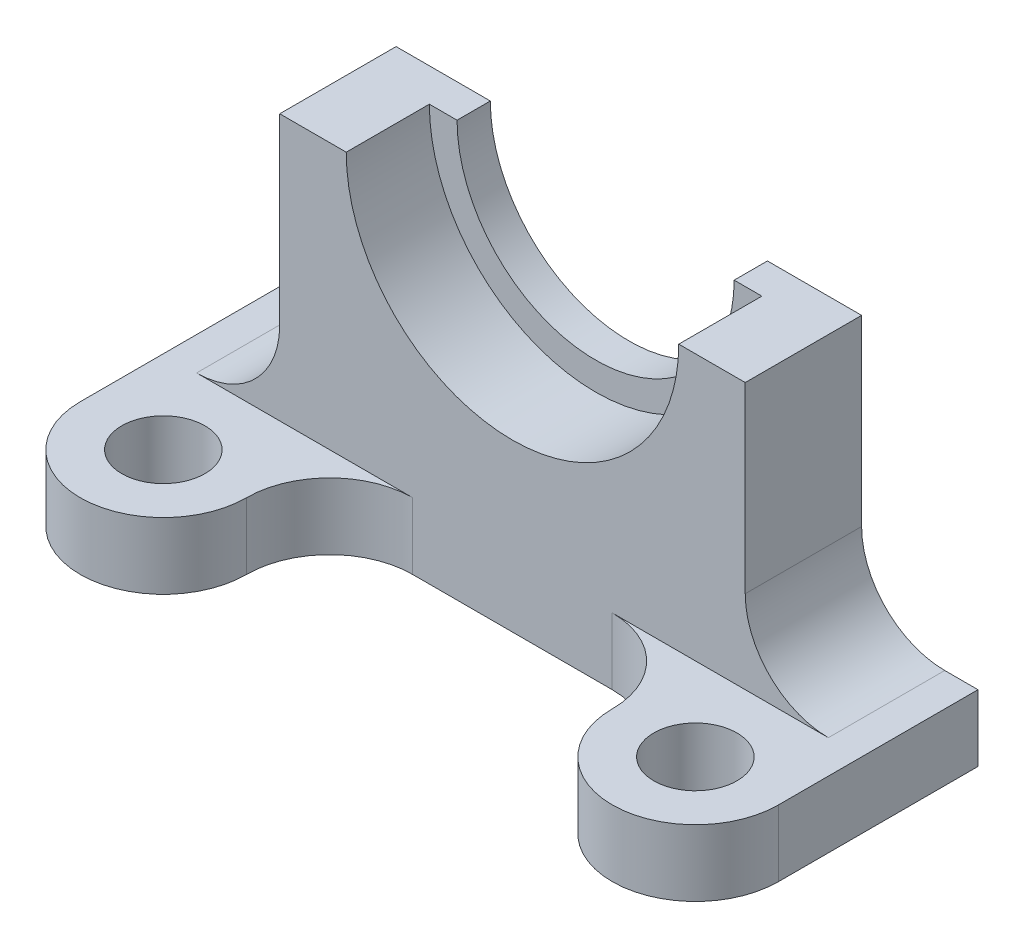
ISO-10303-21;
HEADER;
FILE_DESCRIPTION(('STEP AP214'),'2;1');
FILE_NAME('part.step','',(''),(''),'','','');
FILE_SCHEMA(('AUTOMOTIVE_DESIGN { 1 0 10303 214 1 1 1 1 }'));
ENDSEC;
DATA;
#1=APPLICATION_CONTEXT('core data for automotive mechanical design processes');
#2=APPLICATION_PROTOCOL_DEFINITION('international standard','automotive_design',2000,#1);
#3=PRODUCT_CONTEXT('',#1,'mechanical');
#4=PRODUCT('Part','Part','',(#3));
#5=PRODUCT_RELATED_PRODUCT_CATEGORY('part','',(#4));
#6=PRODUCT_DEFINITION_FORMATION('','',#4);
#7=PRODUCT_DEFINITION_CONTEXT('part definition',#1,'design');
#8=PRODUCT_DEFINITION('design','',#6,#7);
#9=PRODUCT_DEFINITION_SHAPE('','',#8);
#10=(LENGTH_UNIT() NAMED_UNIT(*) SI_UNIT(.MILLI.,.METRE.));
#11=(NAMED_UNIT(*) PLANE_ANGLE_UNIT() SI_UNIT($,.RADIAN.));
#12=(NAMED_UNIT(*) SI_UNIT($,.STERADIAN.) SOLID_ANGLE_UNIT());
#13=UNCERTAINTY_MEASURE_WITH_UNIT(LENGTH_MEASURE(1.E-05),#10,'distance_accuracy_value','');
#14=(GEOMETRIC_REPRESENTATION_CONTEXT(3) GLOBAL_UNCERTAINTY_ASSIGNED_CONTEXT((#13)) GLOBAL_UNIT_ASSIGNED_CONTEXT((#10,
#11,#12)) REPRESENTATION_CONTEXT('',''));
#15=CARTESIAN_POINT('',(0.,0.,0.));
#16=DIRECTION('',(0.,0.,1.));
#17=DIRECTION('',(1.,0.,0.));
#18=AXIS2_PLACEMENT_3D('',#15,#16,#17);
#19=CARTESIAN_POINT('',(210.,120.,-30.));
#20=DIRECTION('',(0.,1.,0.));
#21=DIRECTION('',(0.,0.,1.));
#22=AXIS2_PLACEMENT_3D('',#19,#20,#21);
#23=PLANE('',#22);
#24=DIRECTION('',(0.,0.,1.));
#25=VECTOR('',#24,1.);
#26=CARTESIAN_POINT('',(76.,120.,-90.));
#27=LINE('',#26,#25);
#28=CARTESIAN_POINT('',(76.,120.,-72.));
#29=VERTEX_POINT('',#28);
#30=CARTESIAN_POINT('',(76.,120.,-60.));
#31=VERTEX_POINT('',#30);
#32=EDGE_CURVE('E161',#29,#31,#27,.T.);
#33=ORIENTED_EDGE('',*,*,#32,.F.);
#34=DIRECTION('',(1.,0.,0.));
#35=VECTOR('',#34,1.);
#36=CARTESIAN_POINT('',(210.,120.,-72.));
#37=LINE('',#36,#35);
#38=CARTESIAN_POINT('',(42.,120.,-72.));
#39=VERTEX_POINT('',#38);
#40=EDGE_CURVE('E228',#39,#29,#37,.T.);
#41=ORIENTED_EDGE('',*,*,#40,.F.);
#42=DIRECTION('',(0.,0.,-1.));
#43=VECTOR('',#42,1.);
#44=CARTESIAN_POINT('',(42.,120.,-30.));
#45=LINE('',#44,#43);
#46=CARTESIAN_POINT('',(42.,120.,-30.));
#47=VERTEX_POINT('',#46);
#48=EDGE_CURVE('E242',#47,#39,#45,.T.);
#49=ORIENTED_EDGE('',*,*,#48,.F.);
#50=DIRECTION('',(1.,0.,0.));
#51=VECTOR('',#50,1.);
#52=CARTESIAN_POINT('',(210.,120.,-30.));
#53=LINE('',#52,#51);
#54=CARTESIAN_POINT('',(66.,120.,-30.));
#55=VERTEX_POINT('',#54);
#56=EDGE_CURVE('E366',#47,#55,#53,.T.);
#57=ORIENTED_EDGE('',*,*,#56,.T.);
#58=DIRECTION('',(0.,0.,1.));
#59=VECTOR('',#58,1.);
#60=CARTESIAN_POINT('',(66.,120.,-60.));
#61=LINE('',#60,#59);
#62=CARTESIAN_POINT('',(66.,120.,-60.));
#63=VERTEX_POINT('',#62);
#64=EDGE_CURVE('E166',#63,#55,#61,.T.);
#65=ORIENTED_EDGE('',*,*,#64,.F.);
#66=DIRECTION('',(1.,0.,0.));
#67=VECTOR('',#66,1.);
#68=CARTESIAN_POINT('',(210.,120.,-60.));
#69=LINE('',#68,#67);
#70=EDGE_CURVE('E182',#63,#31,#69,.T.);
#71=ORIENTED_EDGE('',*,*,#70,.T.);
#72=EDGE_LOOP('',(#33,#41,#49,#57,#65,#71));
#73=FACE_BOUND('',#72,.T.);
#74=ADVANCED_FACE('F33',(#73),#23,.T.);
#75=CARTESIAN_POINT('',(0.,24.,0.));
#76=DIRECTION('',(0.,1.,0.));
#77=DIRECTION('',(0.,0.,1.));
#78=AXIS2_PLACEMENT_3D('',#75,#76,#77);
#79=PLANE('',#78);
#80=CARTESIAN_POINT('',(29.9999999999999,24.,0.));
#81=DIRECTION('',(0.,1.,0.));
#82=DIRECTION('',(0.,0.,1.));
#83=AXIS2_PLACEMENT_3D('',#80,#81,#82);
#84=CIRCLE('',#83,15.);
#85=CARTESIAN_POINT('',(29.9999999999999,24.,15.));
#86=VERTEX_POINT('',#85);
#87=EDGE_CURVE('E266',#86,#86,#84,.T.);
#88=ORIENTED_EDGE('',*,*,#87,.F.);
#89=EDGE_LOOP('',(#88));
#90=FACE_BOUND('',#89,.T.);
#91=DIRECTION('',(-1.,0.,0.));
#92=VECTOR('',#91,1.);
#93=CARTESIAN_POINT('',(42.,24.,-30.));
#94=LINE('',#93,#92);
#95=CARTESIAN_POINT('',(90.,24.,-30.));
#96=VERTEX_POINT('',#95);
#97=CARTESIAN_POINT('',(12.,24.,-30.));
#98=VERTEX_POINT('',#97);
#99=EDGE_CURVE('E183',#96,#98,#94,.T.);
#100=ORIENTED_EDGE('',*,*,#99,.T.);
#101=DIRECTION('',(0.,0.,-1.));
#102=VECTOR('',#101,1.);
#103=CARTESIAN_POINT('',(12.,24.,-72.));
#104=LINE('',#103,#102);
#105=CARTESIAN_POINT('',(12.,24.,-72.));
#106=VERTEX_POINT('',#105);
#107=EDGE_CURVE('E165',#98,#106,#104,.T.);
#108=ORIENTED_EDGE('',*,*,#107,.T.);
#109=DIRECTION('',(1.,0.,0.));
#110=VECTOR('',#109,1.);
#111=CARTESIAN_POINT('',(0.,24.,-72.));
#112=LINE('',#111,#110);
#113=CARTESIAN_POINT('',(0.,24.,-72.));
#114=VERTEX_POINT('',#113);
#115=EDGE_CURVE('E253',#114,#106,#112,.T.);
#116=ORIENTED_EDGE('',*,*,#115,.F.);
#117=DIRECTION('',(0.,0.,-1.));
#118=VECTOR('',#117,1.);
#119=CARTESIAN_POINT('',(0.,24.,0.));
#120=LINE('',#119,#118);
#121=CARTESIAN_POINT('',(0.,24.,0.));
#122=VERTEX_POINT('',#121);
#123=EDGE_CURVE('E247',#122,#114,#120,.T.);
#124=ORIENTED_EDGE('',*,*,#123,.F.);
#125=CARTESIAN_POINT('',(29.9999999999999,24.,0.));
#126=DIRECTION('',(0.,1.,0.));
#127=DIRECTION('',(0.,0.,1.));
#128=AXIS2_PLACEMENT_3D('',#125,#126,#127);
#129=CIRCLE('',#128,30.);
#130=CARTESIAN_POINT('',(60.,24.,0.));
#131=VERTEX_POINT('',#130);
#132=EDGE_CURVE('E210',#122,#131,#129,.T.);
#133=ORIENTED_EDGE('',*,*,#132,.T.);
#134=CARTESIAN_POINT('',(90.,24.,0.));
#135=DIRECTION('',(0.,1.,0.));
#136=DIRECTION('',(0.,0.,1.));
#137=AXIS2_PLACEMENT_3D('',#134,#135,#136);
#138=CIRCLE('',#137,30.);
#139=EDGE_CURVE('E206',#131,#96,#138,.F.);
#140=ORIENTED_EDGE('',*,*,#139,.T.);
#141=EDGE_LOOP('',(#100,#108,#116,#124,#133,#140));
#142=FACE_BOUND('',#141,.T.);
#143=ADVANCED_FACE('F314',(#90,#142),#79,.T.);
#144=CARTESIAN_POINT('',(0.,24.,-72.));
#145=DIRECTION('',(0.,0.,-1.));
#146=DIRECTION('',(-1.,0.,0.));
#147=AXIS2_PLACEMENT_3D('',#144,#145,#146);
#148=PLANE('',#147);
#149=CARTESIAN_POINT('',(126.,120.,-72.));
#150=DIRECTION('',(0.,0.,-1.));
#151=DIRECTION('',(-1.,0.,0.));
#152=AXIS2_PLACEMENT_3D('',#149,#150,#151);
#153=CIRCLE('',#152,50.);
#154=CARTESIAN_POINT('',(176.,120.,-72.));
#155=VERTEX_POINT('',#154);
#156=EDGE_CURVE('E176',#155,#29,#153,.T.);
#157=ORIENTED_EDGE('',*,*,#156,.F.);
#158=CARTESIAN_POINT('',(210.,120.,-72.));
#159=VERTEX_POINT('',#158);
#160=EDGE_CURVE('E175',#155,#159,#37,.T.);
#161=ORIENTED_EDGE('',*,*,#160,.T.);
#162=DIRECTION('',(0.,-1.,0.));
#163=VECTOR('',#162,1.);
#164=CARTESIAN_POINT('',(210.,24.,-72.));
#165=LINE('',#164,#163);
#166=CARTESIAN_POINT('',(210.,54.,-72.));
#167=VERTEX_POINT('',#166);
#168=EDGE_CURVE('E227',#159,#167,#165,.T.);
#169=ORIENTED_EDGE('',*,*,#168,.T.);
#170=CARTESIAN_POINT('',(240.,54.,-72.));
#171=DIRECTION('',(0.,0.,-1.));
#172=DIRECTION('',(-1.,0.,0.));
#173=AXIS2_PLACEMENT_3D('',#170,#171,#172);
#174=CIRCLE('',#173,30.);
#175=CARTESIAN_POINT('',(240.,24.,-72.));
#176=VERTEX_POINT('',#175);
#177=EDGE_CURVE('E41',#167,#176,#174,.F.);
#178=ORIENTED_EDGE('',*,*,#177,.T.);
#179=CARTESIAN_POINT('',(252.,24.,-72.));
#180=VERTEX_POINT('',#179);
#181=EDGE_CURVE('E251',#176,#180,#112,.T.);
#182=ORIENTED_EDGE('',*,*,#181,.T.);
#183=DIRECTION('',(0.,-1.,0.));
#184=VECTOR('',#183,1.);
#185=CARTESIAN_POINT('',(252.,24.,-72.));
#186=LINE('',#185,#184);
#187=CARTESIAN_POINT('',(252.,0.,-72.));
#188=VERTEX_POINT('',#187);
#189=EDGE_CURVE('E264',#180,#188,#186,.T.);
#190=ORIENTED_EDGE('',*,*,#189,.T.);
#191=DIRECTION('',(1.,0.,0.));
#192=VECTOR('',#191,1.);
#193=CARTESIAN_POINT('',(0.,0.,-72.));
#194=LINE('',#193,#192);
#195=CARTESIAN_POINT('',(0.,0.,-72.));
#196=VERTEX_POINT('',#195);
#197=EDGE_CURVE('E241',#196,#188,#194,.T.);
#198=ORIENTED_EDGE('',*,*,#197,.F.);
#199=DIRECTION('',(0.,-1.,0.));
#200=VECTOR('',#199,1.);
#201=CARTESIAN_POINT('',(0.,24.,-72.));
#202=LINE('',#201,#200);
#203=EDGE_CURVE('E186',#114,#196,#202,.T.);
#204=ORIENTED_EDGE('',*,*,#203,.F.);
#205=ORIENTED_EDGE('',*,*,#115,.T.);
#206=CARTESIAN_POINT('',(12.,54.,-72.));
#207=DIRECTION('',(0.,0.,-1.));
#208=DIRECTION('',(-1.,0.,0.));
#209=AXIS2_PLACEMENT_3D('',#206,#207,#208);
#210=CIRCLE('',#209,30.);
#211=CARTESIAN_POINT('',(42.,54.,-72.));
#212=VERTEX_POINT('',#211);
#213=EDGE_CURVE('E317',#106,#212,#210,.F.);
#214=ORIENTED_EDGE('',*,*,#213,.T.);
#215=DIRECTION('',(0.,1.,0.));
#216=VECTOR('',#215,1.);
#217=CARTESIAN_POINT('',(42.,120.,-72.));
#218=LINE('',#217,#216);
#219=EDGE_CURVE('E197',#212,#39,#218,.T.);
#220=ORIENTED_EDGE('',*,*,#219,.T.);
#221=ORIENTED_EDGE('',*,*,#40,.T.);
#222=EDGE_LOOP('',(#157,#161,#169,#178,#182,#190,#198,#204,#205,#214,#220,#221));
#223=FACE_BOUND('',#222,.T.);
#224=ADVANCED_FACE('F316',(#223),#148,.T.);
#225=CARTESIAN_POINT('',(0.,24.,0.));
#226=DIRECTION('',(-1.,0.,0.));
#227=DIRECTION('',(0.,0.,1.));
#228=AXIS2_PLACEMENT_3D('',#225,#226,#227);
#229=PLANE('',#228);
#230=DIRECTION('',(0.,0.,-1.));
#231=VECTOR('',#230,1.);
#232=CARTESIAN_POINT('',(0.,0.,0.));
#233=LINE('',#232,#231);
#234=CARTESIAN_POINT('',(0.,0.,0.));
#235=VERTEX_POINT('',#234);
#236=EDGE_CURVE('E290',#235,#196,#233,.T.);
#237=ORIENTED_EDGE('',*,*,#236,.F.);
#238=DIRECTION('',(0.,-1.,0.));
#239=VECTOR('',#238,1.);
#240=CARTESIAN_POINT('',(0.,24.,0.));
#241=LINE('',#240,#239);
#242=EDGE_CURVE('E257',#122,#235,#241,.T.);
#243=ORIENTED_EDGE('',*,*,#242,.F.);
#244=ORIENTED_EDGE('',*,*,#123,.T.);
#245=ORIENTED_EDGE('',*,*,#203,.T.);
#246=EDGE_LOOP('',(#237,#243,#244,#245));
#247=FACE_BOUND('',#246,.T.);
#248=ADVANCED_FACE('F311',(#247),#229,.T.);
#249=CARTESIAN_POINT('',(29.9999999999999,24.,0.));
#250=DIRECTION('',(0.,-1.,0.));
#251=DIRECTION('',(0.,0.,-1.));
#252=AXIS2_PLACEMENT_3D('',#249,#250,#251);
#253=CYLINDRICAL_SURFACE('',#252,30.);
#254=CARTESIAN_POINT('',(29.9999999999999,0.,0.));
#255=DIRECTION('',(0.,1.,0.));
#256=DIRECTION('',(0.,0.,1.));
#257=AXIS2_PLACEMENT_3D('',#254,#255,#256);
#258=CIRCLE('',#257,30.);
#259=CARTESIAN_POINT('',(60.,0.,0.));
#260=VERTEX_POINT('',#259);
#261=EDGE_CURVE('E288',#235,#260,#258,.T.);
#262=ORIENTED_EDGE('',*,*,#261,.T.);
#263=DIRECTION('',(0.,-1.,0.));
#264=VECTOR('',#263,1.);
#265=CARTESIAN_POINT('',(60.,24.,0.));
#266=LINE('',#265,#264);
#267=EDGE_CURVE('E215',#131,#260,#266,.T.);
#268=ORIENTED_EDGE('',*,*,#267,.F.);
#269=ORIENTED_EDGE('',*,*,#132,.F.);
#270=ORIENTED_EDGE('',*,*,#242,.T.);
#271=EDGE_LOOP('',(#262,#268,#269,#270));
#272=FACE_BOUND('',#271,.T.);
#273=ADVANCED_FACE('F327',(#272),#253,.T.);
#274=CARTESIAN_POINT('',(90.,24.,0.));
#275=DIRECTION('',(0.,-1.,0.));
#276=DIRECTION('',(0.,0.,-1.));
#277=AXIS2_PLACEMENT_3D('',#274,#275,#276);
#278=CYLINDRICAL_SURFACE('',#277,30.);
#279=CARTESIAN_POINT('',(90.,0.,0.));
#280=DIRECTION('',(0.,1.,0.));
#281=DIRECTION('',(0.,0.,1.));
#282=AXIS2_PLACEMENT_3D('',#279,#280,#281);
#283=CIRCLE('',#282,30.);
#284=CARTESIAN_POINT('',(90.,0.,-30.));
#285=VERTEX_POINT('',#284);
#286=EDGE_CURVE('E285',#260,#285,#283,.F.);
#287=ORIENTED_EDGE('',*,*,#286,.T.);
#288=DIRECTION('',(0.,-1.,0.));
#289=VECTOR('',#288,1.);
#290=CARTESIAN_POINT('',(90.,24.,-30.));
#291=LINE('',#290,#289);
#292=EDGE_CURVE('E213',#96,#285,#291,.T.);
#293=ORIENTED_EDGE('',*,*,#292,.F.);
#294=ORIENTED_EDGE('',*,*,#139,.F.);
#295=ORIENTED_EDGE('',*,*,#267,.T.);
#296=EDGE_LOOP('',(#287,#293,#294,#295));
#297=FACE_BOUND('',#296,.T.);
#298=ADVANCED_FACE('F330',(#297),#278,.F.);
#299=CARTESIAN_POINT('',(0.,24.,-30.));
#300=DIRECTION('',(0.,0.,1.));
#301=DIRECTION('',(1.,0.,0.));
#302=AXIS2_PLACEMENT_3D('',#299,#300,#301);
#303=PLANE('',#302);
#304=CARTESIAN_POINT('',(126.,120.,-30.));
#305=DIRECTION('',(0.,0.,1.));
#306=DIRECTION('',(1.,0.,0.));
#307=AXIS2_PLACEMENT_3D('',#304,#305,#306);
#308=CIRCLE('',#307,60.);
#309=CARTESIAN_POINT('',(186.,120.,-30.));
#310=VERTEX_POINT('',#309);
#311=EDGE_CURVE('E359',#55,#310,#308,.T.);
#312=ORIENTED_EDGE('',*,*,#311,.F.);
#313=ORIENTED_EDGE('',*,*,#56,.F.);
#314=DIRECTION('',(0.,1.,0.));
#315=VECTOR('',#314,1.);
#316=CARTESIAN_POINT('',(42.,120.,-30.));
#317=LINE('',#316,#315);
#318=CARTESIAN_POINT('',(42.,54.,-30.));
#319=VERTEX_POINT('',#318);
#320=EDGE_CURVE('E230',#319,#47,#317,.T.);
#321=ORIENTED_EDGE('',*,*,#320,.F.);
#322=CARTESIAN_POINT('',(12.,54.,-30.));
#323=DIRECTION('',(0.,0.,1.));
#324=DIRECTION('',(1.,0.,0.));
#325=AXIS2_PLACEMENT_3D('',#322,#323,#324);
#326=CIRCLE('',#325,30.);
#327=EDGE_CURVE('E335',#319,#98,#326,.F.);
#328=ORIENTED_EDGE('',*,*,#327,.T.);
#329=ORIENTED_EDGE('',*,*,#99,.F.);
#330=ORIENTED_EDGE('',*,*,#292,.T.);
#331=DIRECTION('',(-1.,0.,0.));
#332=VECTOR('',#331,1.);
#333=CARTESIAN_POINT('',(0.,0.,-30.));
#334=LINE('',#333,#332);
#335=CARTESIAN_POINT('',(162.,0.,-30.));
#336=VERTEX_POINT('',#335);
#337=EDGE_CURVE('E282',#336,#285,#334,.T.);
#338=ORIENTED_EDGE('',*,*,#337,.F.);
#339=DIRECTION('',(0.,-1.,0.));
#340=VECTOR('',#339,1.);
#341=CARTESIAN_POINT('',(162.,24.,-30.));
#342=LINE('',#341,#340);
#343=CARTESIAN_POINT('',(162.,24.,-30.));
#344=VERTEX_POINT('',#343);
#345=EDGE_CURVE('E216',#344,#336,#342,.T.);
#346=ORIENTED_EDGE('',*,*,#345,.F.);
#347=CARTESIAN_POINT('',(240.,24.,-30.));
#348=VERTEX_POINT('',#347);
#349=EDGE_CURVE('E47',#348,#344,#94,.T.);
#350=ORIENTED_EDGE('',*,*,#349,.F.);
#351=CARTESIAN_POINT('',(240.,54.,-30.));
#352=DIRECTION('',(0.,0.,1.));
#353=DIRECTION('',(1.,0.,0.));
#354=AXIS2_PLACEMENT_3D('',#351,#352,#353);
#355=CIRCLE('',#354,30.);
#356=CARTESIAN_POINT('',(210.,54.,-30.));
#357=VERTEX_POINT('',#356);
#358=EDGE_CURVE('E11',#348,#357,#355,.F.);
#359=ORIENTED_EDGE('',*,*,#358,.T.);
#360=DIRECTION('',(0.,-1.,0.));
#361=VECTOR('',#360,1.);
#362=CARTESIAN_POINT('',(210.,24.,-30.));
#363=LINE('',#362,#361);
#364=CARTESIAN_POINT('',(210.,120.,-30.));
#365=VERTEX_POINT('',#364);
#366=EDGE_CURVE('E237',#365,#357,#363,.T.);
#367=ORIENTED_EDGE('',*,*,#366,.F.);
#368=EDGE_CURVE('E365',#310,#365,#53,.T.);
#369=ORIENTED_EDGE('',*,*,#368,.F.);
#370=EDGE_LOOP('',(#312,#313,#321,#328,#329,#330,#338,#346,#350,#359,#367,#369));
#371=FACE_BOUND('',#370,.T.);
#372=ADVANCED_FACE('F337',(#371),#303,.T.);
#373=CARTESIAN_POINT('',(162.,24.,0.));
#374=DIRECTION('',(0.,-1.,0.));
#375=DIRECTION('',(0.,0.,-1.));
#376=AXIS2_PLACEMENT_3D('',#373,#374,#375);
#377=CYLINDRICAL_SURFACE('',#376,30.);
#378=CARTESIAN_POINT('',(162.,0.,0.));
#379=DIRECTION('',(0.,1.,0.));
#380=DIRECTION('',(0.,0.,1.));
#381=AXIS2_PLACEMENT_3D('',#378,#379,#380);
#382=CIRCLE('',#381,30.);
#383=CARTESIAN_POINT('',(192.,0.,0.));
#384=VERTEX_POINT('',#383);
#385=EDGE_CURVE('E279',#384,#336,#382,.T.);
#386=ORIENTED_EDGE('',*,*,#385,.F.);
#387=DIRECTION('',(0.,-1.,0.));
#388=VECTOR('',#387,1.);
#389=CARTESIAN_POINT('',(192.,24.,0.));
#390=LINE('',#389,#388);
#391=CARTESIAN_POINT('',(192.,24.,0.));
#392=VERTEX_POINT('',#391);
#393=EDGE_CURVE('E220',#392,#384,#390,.T.);
#394=ORIENTED_EDGE('',*,*,#393,.F.);
#395=CARTESIAN_POINT('',(162.,24.,0.));
#396=DIRECTION('',(0.,1.,0.));
#397=DIRECTION('',(0.,0.,1.));
#398=AXIS2_PLACEMENT_3D('',#395,#396,#397);
#399=CIRCLE('',#398,30.);
#400=EDGE_CURVE('E209',#392,#344,#399,.T.);
#401=ORIENTED_EDGE('',*,*,#400,.T.);
#402=ORIENTED_EDGE('',*,*,#345,.T.);
#403=EDGE_LOOP('',(#386,#394,#401,#402));
#404=FACE_BOUND('',#403,.T.);
#405=ADVANCED_FACE('F436',(#404),#377,.F.);
#406=CARTESIAN_POINT('',(222.,24.,0.));
#407=DIRECTION('',(0.,-1.,0.));
#408=DIRECTION('',(0.,0.,-1.));
#409=AXIS2_PLACEMENT_3D('',#406,#407,#408);
#410=CYLINDRICAL_SURFACE('',#409,30.);
#411=CARTESIAN_POINT('',(222.,0.,0.));
#412=DIRECTION('',(0.,1.,0.));
#413=DIRECTION('',(0.,0.,1.));
#414=AXIS2_PLACEMENT_3D('',#411,#412,#413);
#415=CIRCLE('',#414,30.);
#416=CARTESIAN_POINT('',(252.,0.,0.));
#417=VERTEX_POINT('',#416);
#418=EDGE_CURVE('E276',#417,#384,#415,.F.);
#419=ORIENTED_EDGE('',*,*,#418,.F.);
#420=DIRECTION('',(0.,-1.,0.));
#421=VECTOR('',#420,1.);
#422=CARTESIAN_POINT('',(252.,24.,0.));
#423=LINE('',#422,#421);
#424=CARTESIAN_POINT('',(252.,24.,0.));
#425=VERTEX_POINT('',#424);
#426=EDGE_CURVE('E262',#425,#417,#423,.T.);
#427=ORIENTED_EDGE('',*,*,#426,.F.);
#428=CARTESIAN_POINT('',(222.,24.,0.));
#429=DIRECTION('',(0.,1.,0.));
#430=DIRECTION('',(0.,0.,1.));
#431=AXIS2_PLACEMENT_3D('',#428,#429,#430);
#432=CIRCLE('',#431,30.);
#433=EDGE_CURVE('E225',#425,#392,#432,.F.);
#434=ORIENTED_EDGE('',*,*,#433,.T.);
#435=ORIENTED_EDGE('',*,*,#393,.T.);
#436=EDGE_LOOP('',(#419,#427,#434,#435));
#437=FACE_BOUND('',#436,.T.);
#438=ADVANCED_FACE('F536',(#437),#410,.T.);
#439=CARTESIAN_POINT('',(222.,24.,0.));
#440=DIRECTION('',(0.,-1.,0.));
#441=DIRECTION('',(0.,0.,-1.));
#442=AXIS2_PLACEMENT_3D('',#439,#440,#441);
#443=CYLINDRICAL_SURFACE('',#442,15.);
#444=CARTESIAN_POINT('',(222.,24.,0.));
#445=DIRECTION('',(0.,1.,0.));
#446=DIRECTION('',(0.,0.,1.));
#447=AXIS2_PLACEMENT_3D('',#444,#445,#446);
#448=CIRCLE('',#447,15.);
#449=CARTESIAN_POINT('',(222.,24.,15.));
#450=VERTEX_POINT('',#449);
#451=EDGE_CURVE('E297',#450,#450,#448,.T.);
#452=ORIENTED_EDGE('',*,*,#451,.T.);
#453=EDGE_LOOP('',(#452));
#454=FACE_BOUND('',#453,.T.);
#455=CARTESIAN_POINT('',(222.,0.,0.));
#456=DIRECTION('',(0.,1.,0.));
#457=DIRECTION('',(0.,0.,1.));
#458=AXIS2_PLACEMENT_3D('',#455,#456,#457);
#459=CIRCLE('',#458,15.);
#460=CARTESIAN_POINT('',(222.,0.,15.));
#461=VERTEX_POINT('',#460);
#462=EDGE_CURVE('E270',#461,#461,#459,.T.);
#463=ORIENTED_EDGE('',*,*,#462,.F.);
#464=EDGE_LOOP('',(#463));
#465=FACE_BOUND('',#464,.T.);
#466=ADVANCED_FACE('F540',(#454,#465),#443,.F.);
#467=CARTESIAN_POINT('',(252.,24.,1.94289029309402E-13));
#468=DIRECTION('',(1.,0.,0.));
#469=DIRECTION('',(0.,0.,-1.));
#470=AXIS2_PLACEMENT_3D('',#467,#468,#469);
#471=PLANE('',#470);
#472=DIRECTION('',(0.,0.,1.));
#473=VECTOR('',#472,1.);
#474=CARTESIAN_POINT('',(252.,0.,1.94289029309402E-13));
#475=LINE('',#474,#473);
#476=EDGE_CURVE('E273',#188,#417,#475,.T.);
#477=ORIENTED_EDGE('',*,*,#476,.F.);
#478=ORIENTED_EDGE('',*,*,#189,.F.);
#479=DIRECTION('',(0.,0.,1.));
#480=VECTOR('',#479,1.);
#481=CARTESIAN_POINT('',(252.,24.,1.94289029309402E-13));
#482=LINE('',#481,#480);
#483=EDGE_CURVE('E300',#180,#425,#482,.T.);
#484=ORIENTED_EDGE('',*,*,#483,.T.);
#485=ORIENTED_EDGE('',*,*,#426,.T.);
#486=EDGE_LOOP('',(#477,#478,#484,#485));
#487=FACE_BOUND('',#486,.T.);
#488=ADVANCED_FACE('F542',(#487),#471,.T.);
#489=CARTESIAN_POINT('',(29.9999999999999,24.,0.));
#490=DIRECTION('',(0.,-1.,0.));
#491=DIRECTION('',(0.,0.,-1.));
#492=AXIS2_PLACEMENT_3D('',#489,#490,#491);
#493=CYLINDRICAL_SURFACE('',#492,15.);
#494=ORIENTED_EDGE('',*,*,#87,.T.);
#495=EDGE_LOOP('',(#494));
#496=FACE_BOUND('',#495,.T.);
#497=CARTESIAN_POINT('',(29.9999999999999,0.,0.));
#498=DIRECTION('',(0.,1.,0.));
#499=DIRECTION('',(0.,0.,1.));
#500=AXIS2_PLACEMENT_3D('',#497,#498,#499);
#501=CIRCLE('',#500,15.);
#502=CARTESIAN_POINT('',(29.9999999999999,0.,15.));
#503=VERTEX_POINT('',#502);
#504=EDGE_CURVE('E267',#503,#503,#501,.T.);
#505=ORIENTED_EDGE('',*,*,#504,.F.);
#506=EDGE_LOOP('',(#505));
#507=FACE_BOUND('',#506,.T.);
#508=ADVANCED_FACE('F492',(#496,#507),#493,.F.);
#509=ORIENTED_EDGE('',*,*,#181,.F.);
#510=DIRECTION('',(0.,0.,-1.));
#511=VECTOR('',#510,1.);
#512=CARTESIAN_POINT('',(240.,24.,-30.));
#513=LINE('',#512,#511);
#514=EDGE_CURVE('E343',#176,#348,#513,.F.);
#515=ORIENTED_EDGE('',*,*,#514,.T.);
#516=ORIENTED_EDGE('',*,*,#349,.T.);
#517=ORIENTED_EDGE('',*,*,#400,.F.);
#518=ORIENTED_EDGE('',*,*,#433,.F.);
#519=ORIENTED_EDGE('',*,*,#483,.F.);
#520=EDGE_LOOP('',(#509,#515,#516,#517,#518,#519));
#521=FACE_BOUND('',#520,.T.);
#522=ORIENTED_EDGE('',*,*,#451,.F.);
#523=EDGE_LOOP('',(#522));
#524=FACE_BOUND('',#523,.T.);
#525=ADVANCED_FACE('F384',(#521,#524),#79,.T.);
#526=CARTESIAN_POINT('',(0.,0.,0.));
#527=DIRECTION('',(0.,1.,0.));
#528=DIRECTION('',(0.,0.,1.));
#529=AXIS2_PLACEMENT_3D('',#526,#527,#528);
#530=PLANE('',#529);
#531=ORIENTED_EDGE('',*,*,#197,.T.);
#532=ORIENTED_EDGE('',*,*,#476,.T.);
#533=ORIENTED_EDGE('',*,*,#418,.T.);
#534=ORIENTED_EDGE('',*,*,#385,.T.);
#535=ORIENTED_EDGE('',*,*,#337,.T.);
#536=ORIENTED_EDGE('',*,*,#286,.F.);
#537=ORIENTED_EDGE('',*,*,#261,.F.);
#538=ORIENTED_EDGE('',*,*,#236,.T.);
#539=EDGE_LOOP('',(#531,#532,#533,#534,#535,#536,#537,#538));
#540=FACE_BOUND('',#539,.T.);
#541=ORIENTED_EDGE('',*,*,#462,.T.);
#542=EDGE_LOOP('',(#541));
#543=FACE_BOUND('',#542,.T.);
#544=ORIENTED_EDGE('',*,*,#504,.T.);
#545=EDGE_LOOP('',(#544));
#546=FACE_BOUND('',#545,.T.);
#547=ADVANCED_FACE('F323',(#540,#543,#546),#530,.F.);
#548=CARTESIAN_POINT('',(210.,24.,-30.));
#549=DIRECTION('',(1.,0.,0.));
#550=DIRECTION('',(0.,0.,-1.));
#551=AXIS2_PLACEMENT_3D('',#548,#549,#550);
#552=PLANE('',#551);
#553=ORIENTED_EDGE('',*,*,#366,.T.);
#554=DIRECTION('',(0.,0.,-1.));
#555=VECTOR('',#554,1.);
#556=CARTESIAN_POINT('',(210.,54.,-72.));
#557=LINE('',#556,#555);
#558=EDGE_CURVE('E345',#357,#167,#557,.T.);
#559=ORIENTED_EDGE('',*,*,#558,.T.);
#560=ORIENTED_EDGE('',*,*,#168,.F.);
#561=DIRECTION('',(0.,0.,-1.));
#562=VECTOR('',#561,1.);
#563=CARTESIAN_POINT('',(210.,120.,-30.));
#564=LINE('',#563,#562);
#565=EDGE_CURVE('E239',#365,#159,#564,.T.);
#566=ORIENTED_EDGE('',*,*,#565,.F.);
#567=EDGE_LOOP('',(#553,#559,#560,#566));
#568=FACE_BOUND('',#567,.T.);
#569=ADVANCED_FACE('F370',(#568),#552,.T.);
#570=DIRECTION('',(0.,0.,1.));
#571=VECTOR('',#570,1.);
#572=CARTESIAN_POINT('',(176.,120.,-90.));
#573=LINE('',#572,#571);
#574=CARTESIAN_POINT('',(176.,120.,-60.));
#575=VERTEX_POINT('',#574);
#576=EDGE_CURVE('E158',#575,#155,#573,.F.);
#577=ORIENTED_EDGE('',*,*,#576,.F.);
#578=CARTESIAN_POINT('',(186.,120.,-60.));
#579=VERTEX_POINT('',#578);
#580=EDGE_CURVE('E172',#575,#579,#69,.T.);
#581=ORIENTED_EDGE('',*,*,#580,.T.);
#582=DIRECTION('',(0.,0.,1.));
#583=VECTOR('',#582,1.);
#584=CARTESIAN_POINT('',(186.,120.,-60.));
#585=LINE('',#584,#583);
#586=EDGE_CURVE('E185',#310,#579,#585,.F.);
#587=ORIENTED_EDGE('',*,*,#586,.F.);
#588=ORIENTED_EDGE('',*,*,#368,.T.);
#589=ORIENTED_EDGE('',*,*,#565,.T.);
#590=ORIENTED_EDGE('',*,*,#160,.F.);
#591=EDGE_LOOP('',(#577,#581,#587,#588,#589,#590));
#592=FACE_BOUND('',#591,.T.);
#593=ADVANCED_FACE('F170',(#592),#23,.T.);
#594=CARTESIAN_POINT('',(42.,120.,-30.));
#595=DIRECTION('',(-1.,0.,0.));
#596=DIRECTION('',(0.,0.,1.));
#597=AXIS2_PLACEMENT_3D('',#594,#595,#596);
#598=PLANE('',#597);
#599=ORIENTED_EDGE('',*,*,#219,.F.);
#600=DIRECTION('',(0.,0.,-1.));
#601=VECTOR('',#600,1.);
#602=CARTESIAN_POINT('',(42.,54.,-30.));
#603=LINE('',#602,#601);
#604=EDGE_CURVE('E196',#212,#319,#603,.F.);
#605=ORIENTED_EDGE('',*,*,#604,.T.);
#606=ORIENTED_EDGE('',*,*,#320,.T.);
#607=ORIENTED_EDGE('',*,*,#48,.T.);
#608=EDGE_LOOP('',(#599,#605,#606,#607));
#609=FACE_BOUND('',#608,.T.);
#610=ADVANCED_FACE('F354',(#609),#598,.T.);
#611=CARTESIAN_POINT('',(126.,120.,-60.));
#612=DIRECTION('',(0.,0.,1.));
#613=DIRECTION('',(1.,0.,0.));
#614=AXIS2_PLACEMENT_3D('',#611,#612,#613);
#615=CYLINDRICAL_SURFACE('',#614,60.);
#616=ORIENTED_EDGE('',*,*,#64,.T.);
#617=ORIENTED_EDGE('',*,*,#311,.T.);
#618=ORIENTED_EDGE('',*,*,#586,.T.);
#619=CARTESIAN_POINT('',(126.,120.,-60.));
#620=DIRECTION('',(0.,0.,1.));
#621=DIRECTION('',(1.,0.,0.));
#622=AXIS2_PLACEMENT_3D('',#619,#620,#621);
#623=CIRCLE('',#622,60.);
#624=EDGE_CURVE('E180',#63,#579,#623,.T.);
#625=ORIENTED_EDGE('',*,*,#624,.F.);
#626=EDGE_LOOP('',(#616,#617,#618,#625));
#627=FACE_BOUND('',#626,.T.);
#628=ADVANCED_FACE('F393',(#627),#615,.F.);
#629=CARTESIAN_POINT('',(126.,120.,-60.));
#630=DIRECTION('',(0.,0.,1.));
#631=DIRECTION('',(1.,0.,0.));
#632=AXIS2_PLACEMENT_3D('',#629,#630,#631);
#633=PLANE('',#632);
#634=CARTESIAN_POINT('',(126.,120.,-60.));
#635=DIRECTION('',(0.,0.,1.));
#636=DIRECTION('',(1.,0.,0.));
#637=AXIS2_PLACEMENT_3D('',#634,#635,#636);
#638=CIRCLE('',#637,50.);
#639=EDGE_CURVE('E155',#31,#575,#638,.T.);
#640=ORIENTED_EDGE('',*,*,#639,.F.);
#641=ORIENTED_EDGE('',*,*,#70,.F.);
#642=ORIENTED_EDGE('',*,*,#624,.T.);
#643=ORIENTED_EDGE('',*,*,#580,.F.);
#644=EDGE_LOOP('',(#640,#641,#642,#643));
#645=FACE_BOUND('',#644,.T.);
#646=ADVANCED_FACE('F178',(#645),#633,.T.);
#647=CARTESIAN_POINT('',(126.,120.,-90.));
#648=DIRECTION('',(0.,0.,1.));
#649=DIRECTION('',(1.,0.,0.));
#650=AXIS2_PLACEMENT_3D('',#647,#648,#649);
#651=CYLINDRICAL_SURFACE('',#650,50.);
#652=ORIENTED_EDGE('',*,*,#32,.T.);
#653=ORIENTED_EDGE('',*,*,#639,.T.);
#654=ORIENTED_EDGE('',*,*,#576,.T.);
#655=ORIENTED_EDGE('',*,*,#156,.T.);
#656=EDGE_LOOP('',(#652,#653,#654,#655));
#657=FACE_BOUND('',#656,.T.);
#658=ADVANCED_FACE('F157',(#657),#651,.F.);
#659=CARTESIAN_POINT('',(12.,54.,0.));
#660=DIRECTION('',(0.,0.,1.));
#661=DIRECTION('',(1.,0.,0.));
#662=AXIS2_PLACEMENT_3D('',#659,#660,#661);
#663=CYLINDRICAL_SURFACE('',#662,30.);
#664=ORIENTED_EDGE('',*,*,#327,.F.);
#665=ORIENTED_EDGE('',*,*,#604,.F.);
#666=ORIENTED_EDGE('',*,*,#213,.F.);
#667=ORIENTED_EDGE('',*,*,#107,.F.);
#668=EDGE_LOOP('',(#664,#665,#666,#667));
#669=FACE_BOUND('',#668,.T.);
#670=ADVANCED_FACE('F342',(#669),#663,.F.);
#671=CARTESIAN_POINT('',(240.,54.,-30.));
#672=DIRECTION('',(0.,0.,1.));
#673=DIRECTION('',(1.,0.,0.));
#674=AXIS2_PLACEMENT_3D('',#671,#672,#673);
#675=CYLINDRICAL_SURFACE('',#674,30.);
#676=ORIENTED_EDGE('',*,*,#358,.F.);
#677=ORIENTED_EDGE('',*,*,#514,.F.);
#678=ORIENTED_EDGE('',*,*,#177,.F.);
#679=ORIENTED_EDGE('',*,*,#558,.F.);
#680=EDGE_LOOP('',(#676,#677,#678,#679));
#681=FACE_BOUND('',#680,.T.);
#682=ADVANCED_FACE('F35',(#681),#675,.F.);
#683=CLOSED_SHELL('',(#74,#143,#224,#248,#273,#298,#372,#405,#438,#466,#488,#508,#525,#547,#569,
#593,#610,#628,#646,#658,#670,#682));
#684=MANIFOLD_SOLID_BREP('B2',#683);
#685=ADVANCED_BREP_SHAPE_REPRESENTATION('',(#18,#684),#14);
#686=SHAPE_DEFINITION_REPRESENTATION(#9,#685);
ENDSEC;
END-ISO-10303-21;
